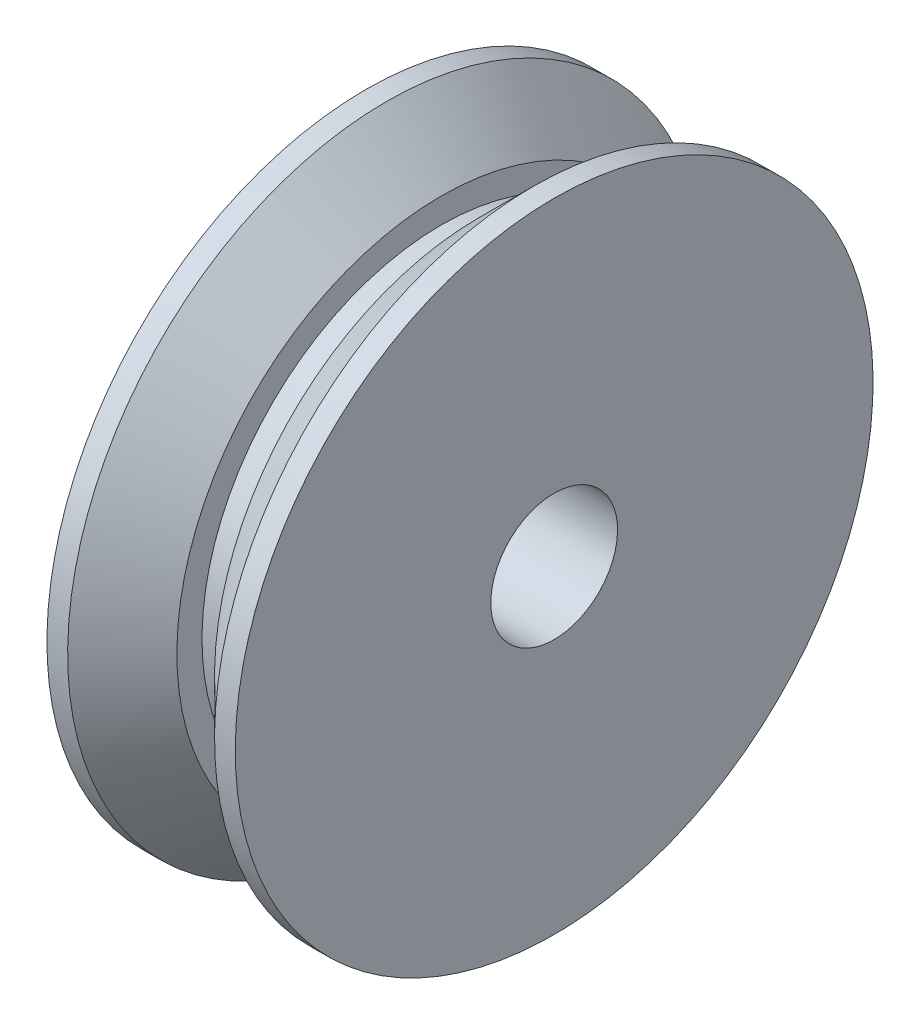
ISO-10303-21;
HEADER;
FILE_DESCRIPTION(('STEP AP214'),'2;1');
FILE_NAME('part.step','',(''),(''),'','','');
FILE_SCHEMA(('AUTOMOTIVE_DESIGN { 1 0 10303 214 1 1 1 1 }'));
ENDSEC;
DATA;
#1=APPLICATION_CONTEXT('core data for automotive mechanical design processes');
#2=APPLICATION_PROTOCOL_DEFINITION('international standard','automotive_design',2000,#1);
#3=PRODUCT_CONTEXT('',#1,'mechanical');
#4=PRODUCT('Part','Part','',(#3));
#5=PRODUCT_RELATED_PRODUCT_CATEGORY('part','',(#4));
#6=PRODUCT_DEFINITION_FORMATION('','',#4);
#7=PRODUCT_DEFINITION_CONTEXT('part definition',#1,'design');
#8=PRODUCT_DEFINITION('design','',#6,#7);
#9=PRODUCT_DEFINITION_SHAPE('','',#8);
#10=(LENGTH_UNIT() NAMED_UNIT(*) SI_UNIT(.MILLI.,.METRE.));
#11=(NAMED_UNIT(*) PLANE_ANGLE_UNIT() SI_UNIT($,.RADIAN.));
#12=(NAMED_UNIT(*) SI_UNIT($,.STERADIAN.) SOLID_ANGLE_UNIT());
#13=UNCERTAINTY_MEASURE_WITH_UNIT(LENGTH_MEASURE(1.E-05),#10,'distance_accuracy_value','');
#14=(GEOMETRIC_REPRESENTATION_CONTEXT(3) GLOBAL_UNCERTAINTY_ASSIGNED_CONTEXT((#13)) GLOBAL_UNIT_ASSIGNED_CONTEXT((#10,
#11,#12)) REPRESENTATION_CONTEXT('',''));
#15=CARTESIAN_POINT('',(0.,0.,0.));
#16=DIRECTION('',(0.,0.,1.));
#17=DIRECTION('',(1.,0.,0.));
#18=AXIS2_PLACEMENT_3D('',#15,#16,#17);
#19=CARTESIAN_POINT('',(-1.5,0.,0.));
#20=DIRECTION('',(1.,0.,0.));
#21=DIRECTION('',(0.,1.,0.));
#22=AXIS2_PLACEMENT_3D('',#19,#20,#21);
#23=PLANE('',#22);
#24=CARTESIAN_POINT('',(-1.5,0.,0.));
#25=DIRECTION('',(1.,0.,0.));
#26=DIRECTION('',(0.,1.,0.));
#27=AXIS2_PLACEMENT_3D('',#24,#25,#26);
#28=CIRCLE('',#27,21.05);
#29=CARTESIAN_POINT('',(-1.5,21.05,0.));
#30=VERTEX_POINT('',#29);
#31=EDGE_CURVE('E78',#30,#30,#28,.T.);
#32=ORIENTED_EDGE('',*,*,#31,.T.);
#33=EDGE_LOOP('',(#32));
#34=FACE_BOUND('',#33,.T.);
#35=CARTESIAN_POINT('',(-1.5,0.,0.));
#36=DIRECTION('',(1.,0.,0.));
#37=DIRECTION('',(0.,1.,0.));
#38=AXIS2_PLACEMENT_3D('',#35,#36,#37);
#39=CIRCLE('',#38,19.05);
#40=CARTESIAN_POINT('',(-1.5,19.05,0.));
#41=VERTEX_POINT('',#40);
#42=EDGE_CURVE('E12',#41,#41,#39,.T.);
#43=ORIENTED_EDGE('',*,*,#42,.F.);
#44=EDGE_LOOP('',(#43));
#45=FACE_BOUND('',#44,.T.);
#46=ADVANCED_FACE('F44',(#34,#45),#23,.T.);
#47=CARTESIAN_POINT('',(0.,0.,0.));
#48=DIRECTION('',(1.,0.,0.));
#49=DIRECTION('',(0.,1.,0.));
#50=AXIS2_PLACEMENT_3D('',#47,#48,#49);
#51=CYLINDRICAL_SURFACE('',#50,19.05);
#52=CARTESIAN_POINT('',(1.5,0.,0.));
#53=DIRECTION('',(1.,0.,0.));
#54=DIRECTION('',(0.,1.,0.));
#55=AXIS2_PLACEMENT_3D('',#52,#53,#54);
#56=CIRCLE('',#55,19.05);
#57=CARTESIAN_POINT('',(1.5,19.05,0.));
#58=VERTEX_POINT('',#57);
#59=EDGE_CURVE('E50',#58,#58,#56,.T.);
#60=ORIENTED_EDGE('',*,*,#59,.F.);
#61=EDGE_LOOP('',(#60));
#62=FACE_BOUND('',#61,.T.);
#63=ORIENTED_EDGE('',*,*,#42,.T.);
#64=EDGE_LOOP('',(#63));
#65=FACE_BOUND('',#64,.T.);
#66=ADVANCED_FACE('F96',(#62,#65),#51,.T.);
#67=CARTESIAN_POINT('',(1.5,0.,0.));
#68=DIRECTION('',(1.,0.,0.));
#69=DIRECTION('',(0.,1.,0.));
#70=AXIS2_PLACEMENT_3D('',#67,#68,#69);
#71=PLANE('',#70);
#72=CARTESIAN_POINT('',(1.5,0.,0.));
#73=DIRECTION('',(1.,0.,0.));
#74=DIRECTION('',(0.,1.,0.));
#75=AXIS2_PLACEMENT_3D('',#72,#73,#74);
#76=CIRCLE('',#75,21.05);
#77=CARTESIAN_POINT('',(1.5,21.05,0.));
#78=VERTEX_POINT('',#77);
#79=EDGE_CURVE('E54',#78,#78,#76,.T.);
#80=ORIENTED_EDGE('',*,*,#79,.F.);
#81=EDGE_LOOP('',(#80));
#82=FACE_BOUND('',#81,.T.);
#83=ORIENTED_EDGE('',*,*,#59,.T.);
#84=EDGE_LOOP('',(#83));
#85=FACE_BOUND('',#84,.T.);
#86=ADVANCED_FACE('F100',(#82,#85),#71,.F.);
#87=CARTESIAN_POINT('',(5.84999999999998,0.,0.));
#88=DIRECTION('',(1.,0.,0.));
#89=DIRECTION('',(0.,1.,0.));
#90=AXIS2_PLACEMENT_3D('',#87,#88,#89);
#91=CONICAL_SURFACE('',#90,25.4,0.78539816339745);
#92=ORIENTED_EDGE('',*,*,#79,.T.);
#93=EDGE_LOOP('',(#92));
#94=FACE_BOUND('',#93,.T.);
#95=CARTESIAN_POINT('',(5.84999999999998,0.,0.));
#96=DIRECTION('',(1.,0.,0.));
#97=DIRECTION('',(0.,1.,0.));
#98=AXIS2_PLACEMENT_3D('',#95,#96,#97);
#99=CIRCLE('',#98,25.4);
#100=CARTESIAN_POINT('',(5.84999999999998,25.4,0.));
#101=VERTEX_POINT('',#100);
#102=EDGE_CURVE('E58',#101,#101,#99,.T.);
#103=ORIENTED_EDGE('',*,*,#102,.F.);
#104=EDGE_LOOP('',(#103));
#105=FACE_BOUND('',#104,.T.);
#106=ADVANCED_FACE('F105',(#94,#105),#91,.T.);
#107=CARTESIAN_POINT('',(0.,0.,0.));
#108=DIRECTION('',(1.,0.,0.));
#109=DIRECTION('',(0.,1.,0.));
#110=AXIS2_PLACEMENT_3D('',#107,#108,#109);
#111=CYLINDRICAL_SURFACE('',#110,25.4);
#112=ORIENTED_EDGE('',*,*,#102,.T.);
#113=EDGE_LOOP('',(#112));
#114=FACE_BOUND('',#113,.T.);
#115=CARTESIAN_POINT('',(7.5,0.,0.));
#116=DIRECTION('',(1.,0.,0.));
#117=DIRECTION('',(0.,1.,0.));
#118=AXIS2_PLACEMENT_3D('',#115,#116,#117);
#119=CIRCLE('',#118,25.4);
#120=CARTESIAN_POINT('',(7.5,25.4,0.));
#121=VERTEX_POINT('',#120);
#122=EDGE_CURVE('E63',#121,#121,#119,.T.);
#123=ORIENTED_EDGE('',*,*,#122,.F.);
#124=EDGE_LOOP('',(#123));
#125=FACE_BOUND('',#124,.T.);
#126=ADVANCED_FACE('F111',(#114,#125),#111,.T.);
#127=CARTESIAN_POINT('',(7.5,0.,0.));
#128=DIRECTION('',(1.,0.,0.));
#129=DIRECTION('',(0.,1.,0.));
#130=AXIS2_PLACEMENT_3D('',#127,#128,#129);
#131=PLANE('',#130);
#132=ORIENTED_EDGE('',*,*,#122,.T.);
#133=EDGE_LOOP('',(#132));
#134=FACE_BOUND('',#133,.T.);
#135=CARTESIAN_POINT('',(7.5,0.,0.));
#136=DIRECTION('',(1.,0.,0.));
#137=DIRECTION('',(0.,1.,0.));
#138=AXIS2_PLACEMENT_3D('',#135,#136,#137);
#139=CIRCLE('',#138,5.05);
#140=CARTESIAN_POINT('',(7.5,5.05,0.));
#141=VERTEX_POINT('',#140);
#142=EDGE_CURVE('E66',#141,#141,#139,.T.);
#143=ORIENTED_EDGE('',*,*,#142,.F.);
#144=EDGE_LOOP('',(#143));
#145=FACE_BOUND('',#144,.T.);
#146=ADVANCED_FACE('F115',(#134,#145),#131,.T.);
#147=CARTESIAN_POINT('',(0.,0.,0.));
#148=DIRECTION('',(1.,0.,0.));
#149=DIRECTION('',(0.,1.,0.));
#150=AXIS2_PLACEMENT_3D('',#147,#148,#149);
#151=CYLINDRICAL_SURFACE('',#150,5.05);
#152=ORIENTED_EDGE('',*,*,#142,.T.);
#153=EDGE_LOOP('',(#152));
#154=FACE_BOUND('',#153,.T.);
#155=CARTESIAN_POINT('',(-7.5,0.,0.));
#156=DIRECTION('',(1.,0.,0.));
#157=DIRECTION('',(0.,1.,0.));
#158=AXIS2_PLACEMENT_3D('',#155,#156,#157);
#159=CIRCLE('',#158,5.05);
#160=CARTESIAN_POINT('',(-7.5,5.05,0.));
#161=VERTEX_POINT('',#160);
#162=EDGE_CURVE('E69',#161,#161,#159,.T.);
#163=ORIENTED_EDGE('',*,*,#162,.F.);
#164=EDGE_LOOP('',(#163));
#165=FACE_BOUND('',#164,.T.);
#166=ADVANCED_FACE('F119',(#154,#165),#151,.F.);
#167=CARTESIAN_POINT('',(-7.5,0.,0.));
#168=DIRECTION('',(1.,0.,0.));
#169=DIRECTION('',(0.,1.,0.));
#170=AXIS2_PLACEMENT_3D('',#167,#168,#169);
#171=PLANE('',#170);
#172=CARTESIAN_POINT('',(-7.5,0.,0.));
#173=DIRECTION('',(1.,0.,0.));
#174=DIRECTION('',(0.,1.,0.));
#175=AXIS2_PLACEMENT_3D('',#172,#173,#174);
#176=CIRCLE('',#175,25.4);
#177=CARTESIAN_POINT('',(-7.5,25.4,0.));
#178=VERTEX_POINT('',#177);
#179=EDGE_CURVE('E72',#178,#178,#176,.T.);
#180=ORIENTED_EDGE('',*,*,#179,.F.);
#181=EDGE_LOOP('',(#180));
#182=FACE_BOUND('',#181,.T.);
#183=ORIENTED_EDGE('',*,*,#162,.T.);
#184=EDGE_LOOP('',(#183));
#185=FACE_BOUND('',#184,.T.);
#186=ADVANCED_FACE('F92',(#182,#185),#171,.F.);
#187=CARTESIAN_POINT('',(0.,0.,0.));
#188=DIRECTION('',(1.,0.,0.));
#189=DIRECTION('',(0.,1.,0.));
#190=AXIS2_PLACEMENT_3D('',#187,#188,#189);
#191=CYLINDRICAL_SURFACE('',#190,25.4);
#192=ORIENTED_EDGE('',*,*,#179,.T.);
#193=EDGE_LOOP('',(#192));
#194=FACE_BOUND('',#193,.T.);
#195=CARTESIAN_POINT('',(-5.84999999999998,0.,0.));
#196=DIRECTION('',(1.,0.,0.));
#197=DIRECTION('',(0.,1.,0.));
#198=AXIS2_PLACEMENT_3D('',#195,#196,#197);
#199=CIRCLE('',#198,25.4);
#200=CARTESIAN_POINT('',(-5.84999999999998,25.4,0.));
#201=VERTEX_POINT('',#200);
#202=EDGE_CURVE('E75',#201,#201,#199,.T.);
#203=ORIENTED_EDGE('',*,*,#202,.F.);
#204=EDGE_LOOP('',(#203));
#205=FACE_BOUND('',#204,.T.);
#206=ADVANCED_FACE('F86',(#194,#205),#191,.T.);
#207=CARTESIAN_POINT('',(-1.5,0.,0.));
#208=DIRECTION('',(-1.,0.,0.));
#209=DIRECTION('',(0.,-1.,0.));
#210=AXIS2_PLACEMENT_3D('',#207,#208,#209);
#211=CONICAL_SURFACE('',#210,21.05,0.78539816339745);
#212=ORIENTED_EDGE('',*,*,#202,.T.);
#213=EDGE_LOOP('',(#212));
#214=FACE_BOUND('',#213,.T.);
#215=ORIENTED_EDGE('',*,*,#31,.F.);
#216=EDGE_LOOP('',(#215));
#217=FACE_BOUND('',#216,.T.);
#218=ADVANCED_FACE('F84',(#214,#217),#211,.T.);
#219=CLOSED_SHELL('',(#46,#66,#86,#106,#126,#146,#166,#186,#206,#218));
#220=MANIFOLD_SOLID_BREP('B2',#219);
#221=ADVANCED_BREP_SHAPE_REPRESENTATION('',(#18,#220),#14);
#222=SHAPE_DEFINITION_REPRESENTATION(#9,#221);
ENDSEC;
END-ISO-10303-21;
